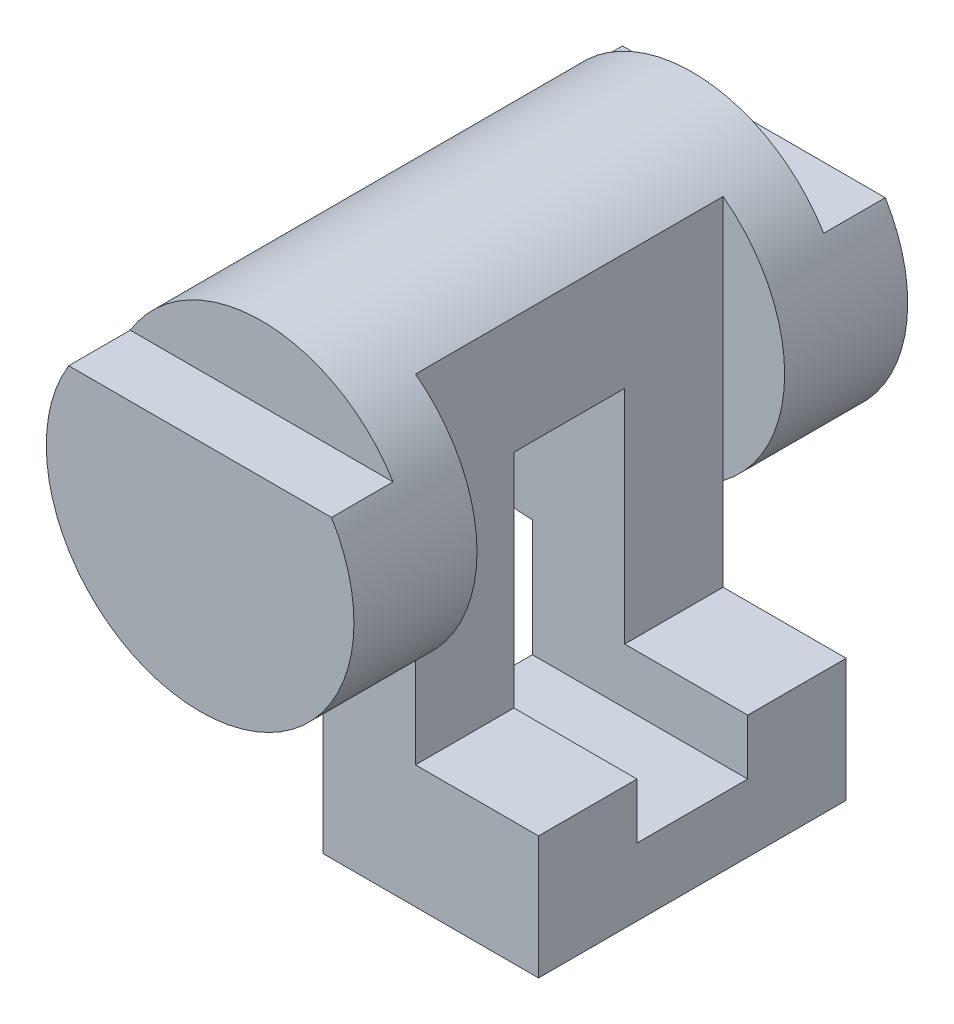
ISO-10303-21;
HEADER;
FILE_DESCRIPTION(('STEP AP214'),'2;1');
FILE_NAME('part.step','',(''),(''),'','','');
FILE_SCHEMA(('AUTOMOTIVE_DESIGN { 1 0 10303 214 1 1 1 1 }'));
ENDSEC;
DATA;
#1=APPLICATION_CONTEXT('core data for automotive mechanical design processes');
#2=APPLICATION_PROTOCOL_DEFINITION('international standard','automotive_design',2000,#1);
#3=PRODUCT_CONTEXT('',#1,'mechanical');
#4=PRODUCT('Part','Part','',(#3));
#5=PRODUCT_RELATED_PRODUCT_CATEGORY('part','',(#4));
#6=PRODUCT_DEFINITION_FORMATION('','',#4);
#7=PRODUCT_DEFINITION_CONTEXT('part definition',#1,'design');
#8=PRODUCT_DEFINITION('design','',#6,#7);
#9=PRODUCT_DEFINITION_SHAPE('','',#8);
#10=(LENGTH_UNIT() NAMED_UNIT(*) SI_UNIT(.MILLI.,.METRE.));
#11=(NAMED_UNIT(*) PLANE_ANGLE_UNIT() SI_UNIT($,.RADIAN.));
#12=(NAMED_UNIT(*) SI_UNIT($,.STERADIAN.) SOLID_ANGLE_UNIT());
#13=UNCERTAINTY_MEASURE_WITH_UNIT(LENGTH_MEASURE(1.E-05),#10,'distance_accuracy_value','');
#14=(GEOMETRIC_REPRESENTATION_CONTEXT(3) GLOBAL_UNCERTAINTY_ASSIGNED_CONTEXT((#13)) GLOBAL_UNIT_ASSIGNED_CONTEXT((#10,
#11,#12)) REPRESENTATION_CONTEXT('',''));
#15=CARTESIAN_POINT('',(0.,0.,0.));
#16=DIRECTION('',(0.,0.,1.));
#17=DIRECTION('',(1.,0.,0.));
#18=AXIS2_PLACEMENT_3D('',#15,#16,#17);
#19=CARTESIAN_POINT('',(0.,-35.,0.));
#20=DIRECTION('',(0.,-1.,0.));
#21=DIRECTION('',(0.,0.,-1.));
#22=AXIS2_PLACEMENT_3D('',#19,#20,#21);
#23=PLANE('',#22);
#24=DIRECTION('',(0.,0.,-1.));
#25=VECTOR('',#24,1.);
#26=CARTESIAN_POINT('',(35.,-35.,25.));
#27=LINE('',#26,#25);
#28=CARTESIAN_POINT('',(35.,-35.,25.));
#29=VERTEX_POINT('',#28);
#30=CARTESIAN_POINT('',(35.,-35.,9.));
#31=VERTEX_POINT('',#30);
#32=EDGE_CURVE('E216',#29,#31,#27,.T.);
#33=ORIENTED_EDGE('',*,*,#32,.T.);
#34=DIRECTION('',(-1.,0.,0.));
#35=VECTOR('',#34,1.);
#36=CARTESIAN_POINT('',(0.,-35.,9.));
#37=LINE('',#36,#35);
#38=CARTESIAN_POINT('',(15.,-35.,9.));
#39=VERTEX_POINT('',#38);
#40=EDGE_CURVE('E48',#31,#39,#37,.T.);
#41=ORIENTED_EDGE('',*,*,#40,.T.);
#42=DIRECTION('',(0.,0.,1.));
#43=VECTOR('',#42,1.);
#44=CARTESIAN_POINT('',(15.,-35.,25.));
#45=LINE('',#44,#43);
#46=CARTESIAN_POINT('',(15.,-35.,25.));
#47=VERTEX_POINT('',#46);
#48=EDGE_CURVE('E227',#39,#47,#45,.T.);
#49=ORIENTED_EDGE('',*,*,#48,.T.);
#50=DIRECTION('',(1.,0.,0.));
#51=VECTOR('',#50,1.);
#52=CARTESIAN_POINT('',(35.,-35.,25.));
#53=LINE('',#52,#51);
#54=EDGE_CURVE('E220',#47,#29,#53,.T.);
#55=ORIENTED_EDGE('',*,*,#54,.T.);
#56=EDGE_LOOP('',(#33,#41,#49,#55));
#57=FACE_BOUND('',#56,.T.);
#58=ADVANCED_FACE('F40',(#57),#23,.F.);
#59=CARTESIAN_POINT('',(0.,0.,45.));
#60=DIRECTION('',(0.,0.,-1.));
#61=DIRECTION('',(-1.,0.,0.));
#62=AXIS2_PLACEMENT_3D('',#59,#60,#61);
#63=CYLINDRICAL_SURFACE('',#62,25.);
#64=DIRECTION('',(0.,0.,-1.));
#65=VECTOR('',#64,1.);
#66=CARTESIAN_POINT('',(0.,-25.,45.));
#67=LINE('',#66,#65);
#68=CARTESIAN_POINT('',(0.,-25.,-8.99999999999999));
#69=VERTEX_POINT('',#68);
#70=CARTESIAN_POINT('',(0.,-25.,-25.));
#71=VERTEX_POINT('',#70);
#72=EDGE_CURVE('E293',#69,#71,#67,.T.);
#73=ORIENTED_EDGE('',*,*,#72,.F.);
#74=CARTESIAN_POINT('',(0.,0.,-9.));
#75=DIRECTION('',(0.,0.,-1.));
#76=DIRECTION('',(0.,1.,0.));
#77=AXIS2_PLACEMENT_3D('',#74,#75,#76);
#78=CIRCLE('',#77,25.);
#79=CARTESIAN_POINT('',(-24.9799919935936,0.999999999999994,-9.));
#80=VERTEX_POINT('',#79);
#81=EDGE_CURVE('E200',#69,#80,#78,.T.);
#82=ORIENTED_EDGE('',*,*,#81,.T.);
#83=DIRECTION('',(0.,0.,-1.));
#84=VECTOR('',#83,1.);
#85=CARTESIAN_POINT('',(-24.9799919935936,0.999999999999994,45.));
#86=LINE('',#85,#84);
#87=CARTESIAN_POINT('',(-24.9799919935936,0.999999999999994,9.));
#88=VERTEX_POINT('',#87);
#89=EDGE_CURVE('E209',#80,#88,#86,.F.);
#90=ORIENTED_EDGE('',*,*,#89,.T.);
#91=CARTESIAN_POINT('',(0.,0.,9.));
#92=DIRECTION('',(0.,0.,1.));
#93=DIRECTION('',(0.,-1.,0.));
#94=AXIS2_PLACEMENT_3D('',#91,#92,#93);
#95=CIRCLE('',#94,25.);
#96=CARTESIAN_POINT('',(0.,-25.,9.));
#97=VERTEX_POINT('',#96);
#98=EDGE_CURVE('E207',#88,#97,#95,.T.);
#99=ORIENTED_EDGE('',*,*,#98,.T.);
#100=CARTESIAN_POINT('',(0.,-25.,25.));
#101=VERTEX_POINT('',#100);
#102=EDGE_CURVE('E294',#101,#97,#67,.T.);
#103=ORIENTED_EDGE('',*,*,#102,.F.);
#104=CARTESIAN_POINT('',(0.,0.,25.));
#105=DIRECTION('',(0.,0.,-1.));
#106=DIRECTION('',(-1.,0.,0.));
#107=AXIS2_PLACEMENT_3D('',#104,#105,#106);
#108=CIRCLE('',#107,25.);
#109=CARTESIAN_POINT('',(15.,-20.,25.));
#110=VERTEX_POINT('',#109);
#111=EDGE_CURVE('E290',#110,#101,#108,.T.);
#112=ORIENTED_EDGE('',*,*,#111,.F.);
#113=CARTESIAN_POINT('',(15.,20.,25.));
#114=VERTEX_POINT('',#113);
#115=EDGE_CURVE('E291',#114,#110,#108,.T.);
#116=ORIENTED_EDGE('',*,*,#115,.F.);
#117=DIRECTION('',(0.,0.,-1.));
#118=VECTOR('',#117,1.);
#119=CARTESIAN_POINT('',(15.,20.,45.));
#120=LINE('',#119,#118);
#121=CARTESIAN_POINT('',(15.,20.,-25.));
#122=VERTEX_POINT('',#121);
#123=EDGE_CURVE('E218',#114,#122,#120,.T.);
#124=ORIENTED_EDGE('',*,*,#123,.T.);
#125=CARTESIAN_POINT('',(0.,0.,-25.));
#126=DIRECTION('',(0.,0.,1.));
#127=DIRECTION('',(1.,0.,0.));
#128=AXIS2_PLACEMENT_3D('',#125,#126,#127);
#129=CIRCLE('',#128,25.);
#130=CARTESIAN_POINT('',(15.,-20.,-25.));
#131=VERTEX_POINT('',#130);
#132=EDGE_CURVE('E284',#131,#122,#129,.T.);
#133=ORIENTED_EDGE('',*,*,#132,.F.);
#134=EDGE_CURVE('E287',#71,#131,#129,.T.);
#135=ORIENTED_EDGE('',*,*,#134,.F.);
#136=EDGE_LOOP('',(#73,#82,#90,#99,#103,#112,#116,#124,#133,#135));
#137=FACE_BOUND('',#136,.T.);
#138=DIRECTION('',(0.,0.,-1.));
#139=VECTOR('',#138,1.);
#140=CARTESIAN_POINT('',(21.3541565040626,13.,-35.));
#141=LINE('',#140,#139);
#142=CARTESIAN_POINT('',(21.3541565040626,13.,-35.));
#143=VERTEX_POINT('',#142);
#144=CARTESIAN_POINT('',(21.3541565040626,13.,-45.));
#145=VERTEX_POINT('',#144);
#146=EDGE_CURVE('E261',#143,#145,#141,.T.);
#147=ORIENTED_EDGE('',*,*,#146,.F.);
#148=CARTESIAN_POINT('',(0.,0.,-35.));
#149=DIRECTION('',(0.,0.,1.));
#150=DIRECTION('',(1.,0.,0.));
#151=AXIS2_PLACEMENT_3D('',#148,#149,#150);
#152=CIRCLE('',#151,25.);
#153=CARTESIAN_POINT('',(-21.3541565040626,13.,-35.));
#154=VERTEX_POINT('',#153);
#155=EDGE_CURVE('E256',#143,#154,#152,.T.);
#156=ORIENTED_EDGE('',*,*,#155,.T.);
#157=DIRECTION('',(0.,0.,-1.));
#158=VECTOR('',#157,1.);
#159=CARTESIAN_POINT('',(-21.3541565040626,13.,-35.));
#160=LINE('',#159,#158);
#161=CARTESIAN_POINT('',(-21.3541565040626,13.,-45.));
#162=VERTEX_POINT('',#161);
#163=EDGE_CURVE('E265',#154,#162,#160,.T.);
#164=ORIENTED_EDGE('',*,*,#163,.T.);
#165=CARTESIAN_POINT('',(0.,0.,-45.));
#166=DIRECTION('',(0.,0.,1.));
#167=DIRECTION('',(1.,0.,0.));
#168=AXIS2_PLACEMENT_3D('',#165,#166,#167);
#169=CIRCLE('',#168,25.);
#170=EDGE_CURVE('E279',#162,#145,#169,.T.);
#171=ORIENTED_EDGE('',*,*,#170,.T.);
#172=EDGE_LOOP('',(#147,#156,#164,#171));
#173=FACE_BOUND('',#172,.T.);
#174=CARTESIAN_POINT('',(0.,0.,45.));
#175=DIRECTION('',(0.,0.,1.));
#176=DIRECTION('',(1.,0.,0.));
#177=AXIS2_PLACEMENT_3D('',#174,#175,#176);
#178=CIRCLE('',#177,25.);
#179=CARTESIAN_POINT('',(-21.3541565040626,13.,45.));
#180=VERTEX_POINT('',#179);
#181=CARTESIAN_POINT('',(21.3541565040626,13.,45.));
#182=VERTEX_POINT('',#181);
#183=EDGE_CURVE('E281',#180,#182,#178,.T.);
#184=ORIENTED_EDGE('',*,*,#183,.F.);
#185=DIRECTION('',(0.,0.,1.));
#186=VECTOR('',#185,1.);
#187=CARTESIAN_POINT('',(-21.3541565040626,13.,35.));
#188=LINE('',#187,#186);
#189=CARTESIAN_POINT('',(-21.3541565040626,13.,35.));
#190=VERTEX_POINT('',#189);
#191=EDGE_CURVE('E274',#190,#180,#188,.T.);
#192=ORIENTED_EDGE('',*,*,#191,.F.);
#193=CARTESIAN_POINT('',(0.,0.,35.));
#194=DIRECTION('',(0.,0.,1.));
#195=DIRECTION('',(1.,0.,0.));
#196=AXIS2_PLACEMENT_3D('',#193,#194,#195);
#197=CIRCLE('',#196,25.);
#198=CARTESIAN_POINT('',(21.3541565040626,13.,35.));
#199=VERTEX_POINT('',#198);
#200=EDGE_CURVE('E269',#199,#190,#197,.T.);
#201=ORIENTED_EDGE('',*,*,#200,.F.);
#202=DIRECTION('',(0.,0.,1.));
#203=VECTOR('',#202,1.);
#204=CARTESIAN_POINT('',(21.3541565040626,13.,35.));
#205=LINE('',#204,#203);
#206=EDGE_CURVE('E276',#199,#182,#205,.T.);
#207=ORIENTED_EDGE('',*,*,#206,.T.);
#208=EDGE_LOOP('',(#184,#192,#201,#207));
#209=FACE_BOUND('',#208,.T.);
#210=ADVANCED_FACE('F42',(#137,#173,#209),#63,.T.);
#211=CARTESIAN_POINT('',(0.,0.,-45.));
#212=DIRECTION('',(0.,0.,1.));
#213=DIRECTION('',(1.,0.,0.));
#214=AXIS2_PLACEMENT_3D('',#211,#212,#213);
#215=PLANE('',#214);
#216=DIRECTION('',(1.,0.,0.));
#217=VECTOR('',#216,1.);
#218=CARTESIAN_POINT('',(0.,13.,-45.));
#219=LINE('',#218,#217);
#220=EDGE_CURVE('E255',#162,#145,#219,.T.);
#221=ORIENTED_EDGE('',*,*,#220,.T.);
#222=ORIENTED_EDGE('',*,*,#170,.F.);
#223=EDGE_LOOP('',(#221,#222));
#224=FACE_BOUND('',#223,.T.);
#225=ADVANCED_FACE('F360',(#224),#215,.F.);
#226=CARTESIAN_POINT('',(0.,0.,45.));
#227=DIRECTION('',(0.,0.,1.));
#228=DIRECTION('',(1.,0.,0.));
#229=AXIS2_PLACEMENT_3D('',#226,#227,#228);
#230=PLANE('',#229);
#231=DIRECTION('',(1.,0.,0.));
#232=VECTOR('',#231,1.);
#233=CARTESIAN_POINT('',(-21.3541565040626,13.,45.));
#234=LINE('',#233,#232);
#235=EDGE_CURVE('E268',#180,#182,#234,.T.);
#236=ORIENTED_EDGE('',*,*,#235,.F.);
#237=ORIENTED_EDGE('',*,*,#183,.T.);
#238=EDGE_LOOP('',(#236,#237));
#239=FACE_BOUND('',#238,.T.);
#240=ADVANCED_FACE('F492',(#239),#230,.T.);
#241=CARTESIAN_POINT('',(-21.3541565040626,13.,35.));
#242=DIRECTION('',(0.,-1.,0.));
#243=DIRECTION('',(0.,0.,-1.));
#244=AXIS2_PLACEMENT_3D('',#241,#242,#243);
#245=PLANE('',#244);
#246=ORIENTED_EDGE('',*,*,#235,.T.);
#247=ORIENTED_EDGE('',*,*,#206,.F.);
#248=DIRECTION('',(1.,0.,0.));
#249=VECTOR('',#248,1.);
#250=CARTESIAN_POINT('',(-21.3541565040626,13.,35.));
#251=LINE('',#250,#249);
#252=EDGE_CURVE('E271',#190,#199,#251,.T.);
#253=ORIENTED_EDGE('',*,*,#252,.F.);
#254=ORIENTED_EDGE('',*,*,#191,.T.);
#255=EDGE_LOOP('',(#246,#247,#253,#254));
#256=FACE_BOUND('',#255,.T.);
#257=ADVANCED_FACE('F501',(#256),#245,.F.);
#258=CARTESIAN_POINT('',(0.,0.,35.));
#259=DIRECTION('',(0.,0.,1.));
#260=DIRECTION('',(1.,0.,0.));
#261=AXIS2_PLACEMENT_3D('',#258,#259,#260);
#262=PLANE('',#261);
#263=ORIENTED_EDGE('',*,*,#200,.T.);
#264=ORIENTED_EDGE('',*,*,#252,.T.);
#265=EDGE_LOOP('',(#263,#264));
#266=FACE_BOUND('',#265,.T.);
#267=ADVANCED_FACE('F482',(#266),#262,.T.);
#268=CARTESIAN_POINT('',(0.,13.,-35.));
#269=DIRECTION('',(0.,1.,0.));
#270=DIRECTION('',(0.,0.,1.));
#271=AXIS2_PLACEMENT_3D('',#268,#269,#270);
#272=PLANE('',#271);
#273=ORIENTED_EDGE('',*,*,#220,.F.);
#274=ORIENTED_EDGE('',*,*,#163,.F.);
#275=DIRECTION('',(1.,0.,0.));
#276=VECTOR('',#275,1.);
#277=CARTESIAN_POINT('',(0.,13.,-35.));
#278=LINE('',#277,#276);
#279=EDGE_CURVE('E259',#154,#143,#278,.T.);
#280=ORIENTED_EDGE('',*,*,#279,.T.);
#281=ORIENTED_EDGE('',*,*,#146,.T.);
#282=EDGE_LOOP('',(#273,#274,#280,#281));
#283=FACE_BOUND('',#282,.T.);
#284=ADVANCED_FACE('F472',(#283),#272,.T.);
#285=CARTESIAN_POINT('',(0.,0.,-35.));
#286=DIRECTION('',(0.,0.,1.));
#287=DIRECTION('',(1.,0.,0.));
#288=AXIS2_PLACEMENT_3D('',#285,#286,#287);
#289=PLANE('',#288);
#290=ORIENTED_EDGE('',*,*,#155,.F.);
#291=ORIENTED_EDGE('',*,*,#279,.F.);
#292=EDGE_LOOP('',(#290,#291));
#293=FACE_BOUND('',#292,.T.);
#294=ADVANCED_FACE('F425',(#293),#289,.F.);
#295=CARTESIAN_POINT('',(0.,13.,25.));
#296=DIRECTION('',(1.,0.,0.));
#297=DIRECTION('',(0.,0.,-1.));
#298=AXIS2_PLACEMENT_3D('',#295,#296,#297);
#299=PLANE('',#298);
#300=ORIENTED_EDGE('',*,*,#102,.T.);
#301=DIRECTION('',(0.,-1.,0.));
#302=VECTOR('',#301,1.);
#303=CARTESIAN_POINT('',(0.,13.,9.));
#304=LINE('',#303,#302);
#305=CARTESIAN_POINT('',(0.,-44.,9.));
#306=VERTEX_POINT('',#305);
#307=EDGE_CURVE('E205',#97,#306,#304,.T.);
#308=ORIENTED_EDGE('',*,*,#307,.T.);
#309=DIRECTION('',(0.,0.,-1.));
#310=VECTOR('',#309,1.);
#311=CARTESIAN_POINT('',(0.,-44.,25.));
#312=LINE('',#311,#310);
#313=CARTESIAN_POINT('',(0.,-44.,-9.));
#314=VERTEX_POINT('',#313);
#315=EDGE_CURVE('E169',#306,#314,#312,.T.);
#316=ORIENTED_EDGE('',*,*,#315,.T.);
#317=DIRECTION('',(0.,1.,0.));
#318=VECTOR('',#317,1.);
#319=CARTESIAN_POINT('',(0.,13.,-9.));
#320=LINE('',#319,#318);
#321=EDGE_CURVE('E197',#314,#69,#320,.T.);
#322=ORIENTED_EDGE('',*,*,#321,.T.);
#323=ORIENTED_EDGE('',*,*,#72,.T.);
#324=DIRECTION('',(0.,-1.,0.));
#325=VECTOR('',#324,1.);
#326=CARTESIAN_POINT('',(0.,13.,-25.));
#327=LINE('',#326,#325);
#328=CARTESIAN_POINT('',(0.,-55.,-25.));
#329=VERTEX_POINT('',#328);
#330=EDGE_CURVE('E247',#71,#329,#327,.T.);
#331=ORIENTED_EDGE('',*,*,#330,.T.);
#332=DIRECTION('',(0.,0.,1.));
#333=VECTOR('',#332,1.);
#334=CARTESIAN_POINT('',(0.,-55.,25.));
#335=LINE('',#334,#333);
#336=CARTESIAN_POINT('',(0.,-55.,25.));
#337=VERTEX_POINT('',#336);
#338=EDGE_CURVE('E235',#329,#337,#335,.T.);
#339=ORIENTED_EDGE('',*,*,#338,.T.);
#340=DIRECTION('',(0.,-1.,0.));
#341=VECTOR('',#340,1.);
#342=CARTESIAN_POINT('',(0.,13.,25.));
#343=LINE('',#342,#341);
#344=EDGE_CURVE('E253',#101,#337,#343,.T.);
#345=ORIENTED_EDGE('',*,*,#344,.F.);
#346=EDGE_LOOP('',(#300,#308,#316,#322,#323,#331,#339,#345));
#347=FACE_BOUND('',#346,.T.);
#348=ADVANCED_FACE('F338',(#347),#299,.F.);
#349=CARTESIAN_POINT('',(0.,13.,25.));
#350=DIRECTION('',(0.,0.,-1.));
#351=DIRECTION('',(-1.,0.,0.));
#352=AXIS2_PLACEMENT_3D('',#349,#350,#351);
#353=PLANE('',#352);
#354=DIRECTION('',(0.,-1.,0.));
#355=VECTOR('',#354,1.);
#356=CARTESIAN_POINT('',(35.,13.,25.));
#357=LINE('',#356,#355);
#358=CARTESIAN_POINT('',(35.,-55.,25.));
#359=VERTEX_POINT('',#358);
#360=EDGE_CURVE('E251',#29,#359,#357,.T.);
#361=ORIENTED_EDGE('',*,*,#360,.F.);
#362=ORIENTED_EDGE('',*,*,#54,.F.);
#363=DIRECTION('',(0.,1.,0.));
#364=VECTOR('',#363,1.);
#365=CARTESIAN_POINT('',(15.,-108.851648071345,25.));
#366=LINE('',#365,#364);
#367=EDGE_CURVE('E222',#47,#110,#366,.T.);
#368=ORIENTED_EDGE('',*,*,#367,.T.);
#369=ORIENTED_EDGE('',*,*,#111,.T.);
#370=ORIENTED_EDGE('',*,*,#344,.T.);
#371=DIRECTION('',(1.,0.,0.));
#372=VECTOR('',#371,1.);
#373=CARTESIAN_POINT('',(0.,-55.,25.));
#374=LINE('',#373,#372);
#375=EDGE_CURVE('E238',#337,#359,#374,.T.);
#376=ORIENTED_EDGE('',*,*,#375,.T.);
#377=EDGE_LOOP('',(#361,#362,#368,#369,#370,#376));
#378=FACE_BOUND('',#377,.T.);
#379=ADVANCED_FACE('F310',(#378),#353,.F.);
#380=CARTESIAN_POINT('',(35.,13.,25.));
#381=DIRECTION('',(-1.,0.,0.));
#382=DIRECTION('',(0.,0.,1.));
#383=AXIS2_PLACEMENT_3D('',#380,#381,#382);
#384=PLANE('',#383);
#385=DIRECTION('',(0.,0.,-1.));
#386=VECTOR('',#385,1.);
#387=CARTESIAN_POINT('',(35.,-44.,9.));
#388=LINE('',#387,#386);
#389=CARTESIAN_POINT('',(35.,-44.,9.));
#390=VERTEX_POINT('',#389);
#391=CARTESIAN_POINT('',(35.,-44.,-9.));
#392=VERTEX_POINT('',#391);
#393=EDGE_CURVE('E167',#390,#392,#388,.T.);
#394=ORIENTED_EDGE('',*,*,#393,.F.);
#395=DIRECTION('',(0.,-1.,0.));
#396=VECTOR('',#395,1.);
#397=CARTESIAN_POINT('',(35.,0.999999999999994,9.));
#398=LINE('',#397,#396);
#399=EDGE_CURVE('E175',#31,#390,#398,.T.);
#400=ORIENTED_EDGE('',*,*,#399,.F.);
#401=ORIENTED_EDGE('',*,*,#32,.F.);
#402=ORIENTED_EDGE('',*,*,#360,.T.);
#403=DIRECTION('',(0.,0.,-1.));
#404=VECTOR('',#403,1.);
#405=CARTESIAN_POINT('',(35.,-55.,25.));
#406=LINE('',#405,#404);
#407=CARTESIAN_POINT('',(35.,-55.,-25.));
#408=VERTEX_POINT('',#407);
#409=EDGE_CURVE('E241',#359,#408,#406,.T.);
#410=ORIENTED_EDGE('',*,*,#409,.T.);
#411=DIRECTION('',(0.,-1.,0.));
#412=VECTOR('',#411,1.);
#413=CARTESIAN_POINT('',(35.,13.,-25.));
#414=LINE('',#413,#412);
#415=CARTESIAN_POINT('',(35.,-35.,-25.));
#416=VERTEX_POINT('',#415);
#417=EDGE_CURVE('E249',#416,#408,#414,.T.);
#418=ORIENTED_EDGE('',*,*,#417,.F.);
#419=CARTESIAN_POINT('',(35.,-35.,-9.));
#420=VERTEX_POINT('',#419);
#421=EDGE_CURVE('E219',#420,#416,#27,.T.);
#422=ORIENTED_EDGE('',*,*,#421,.F.);
#423=DIRECTION('',(0.,1.,0.));
#424=VECTOR('',#423,1.);
#425=CARTESIAN_POINT('',(35.,0.999999999999994,-9.));
#426=LINE('',#425,#424);
#427=EDGE_CURVE('E62',#392,#420,#426,.T.);
#428=ORIENTED_EDGE('',*,*,#427,.F.);
#429=EDGE_LOOP('',(#394,#400,#401,#402,#410,#418,#422,#428));
#430=FACE_BOUND('',#429,.T.);
#431=ADVANCED_FACE('F183',(#430),#384,.F.);
#432=CARTESIAN_POINT('',(0.,13.,-25.));
#433=DIRECTION('',(0.,0.,1.));
#434=DIRECTION('',(1.,0.,0.));
#435=AXIS2_PLACEMENT_3D('',#432,#433,#434);
#436=PLANE('',#435);
#437=DIRECTION('',(0.,1.,0.));
#438=VECTOR('',#437,1.);
#439=CARTESIAN_POINT('',(15.,-108.851648071345,-25.));
#440=LINE('',#439,#438);
#441=CARTESIAN_POINT('',(15.,-35.,-25.));
#442=VERTEX_POINT('',#441);
#443=EDGE_CURVE('E230',#442,#131,#440,.T.);
#444=ORIENTED_EDGE('',*,*,#443,.F.);
#445=DIRECTION('',(-1.,0.,0.));
#446=VECTOR('',#445,1.);
#447=CARTESIAN_POINT('',(35.,-35.,-25.));
#448=LINE('',#447,#446);
#449=EDGE_CURVE('E213',#416,#442,#448,.T.);
#450=ORIENTED_EDGE('',*,*,#449,.F.);
#451=ORIENTED_EDGE('',*,*,#417,.T.);
#452=DIRECTION('',(-1.,0.,0.));
#453=VECTOR('',#452,1.);
#454=CARTESIAN_POINT('',(0.,-55.,-25.));
#455=LINE('',#454,#453);
#456=EDGE_CURVE('E244',#408,#329,#455,.T.);
#457=ORIENTED_EDGE('',*,*,#456,.T.);
#458=ORIENTED_EDGE('',*,*,#330,.F.);
#459=ORIENTED_EDGE('',*,*,#134,.T.);
#460=EDGE_LOOP('',(#444,#450,#451,#457,#458,#459));
#461=FACE_BOUND('',#460,.T.);
#462=ADVANCED_FACE('F322',(#461),#436,.F.);
#463=CARTESIAN_POINT('',(0.,-55.,0.));
#464=DIRECTION('',(0.,-1.,0.));
#465=DIRECTION('',(0.,0.,-1.));
#466=AXIS2_PLACEMENT_3D('',#463,#464,#465);
#467=PLANE('',#466);
#468=ORIENTED_EDGE('',*,*,#338,.F.);
#469=ORIENTED_EDGE('',*,*,#456,.F.);
#470=ORIENTED_EDGE('',*,*,#409,.F.);
#471=ORIENTED_EDGE('',*,*,#375,.F.);
#472=EDGE_LOOP('',(#468,#469,#470,#471));
#473=FACE_BOUND('',#472,.T.);
#474=ADVANCED_FACE('F318',(#473),#467,.T.);
#475=CARTESIAN_POINT('',(35.,-108.851648071345,-25.));
#476=DIRECTION('',(0.,0.,-1.));
#477=DIRECTION('',(-1.,0.,0.));
#478=AXIS2_PLACEMENT_3D('',#475,#476,#477);
#479=PLANE('',#478);
#480=ORIENTED_EDGE('',*,*,#132,.T.);
#481=EDGE_CURVE('E215',#131,#122,#440,.T.);
#482=ORIENTED_EDGE('',*,*,#481,.F.);
#483=EDGE_LOOP('',(#480,#482));
#484=FACE_BOUND('',#483,.T.);
#485=ADVANCED_FACE('F346',(#484),#479,.F.);
#486=CARTESIAN_POINT('',(35.,-108.851648071345,25.));
#487=DIRECTION('',(0.,0.,1.));
#488=DIRECTION('',(1.,0.,0.));
#489=AXIS2_PLACEMENT_3D('',#486,#487,#488);
#490=PLANE('',#489);
#491=ORIENTED_EDGE('',*,*,#115,.T.);
#492=EDGE_CURVE('E226',#110,#114,#366,.T.);
#493=ORIENTED_EDGE('',*,*,#492,.T.);
#494=EDGE_LOOP('',(#491,#493));
#495=FACE_BOUND('',#494,.T.);
#496=ADVANCED_FACE('F344',(#495),#490,.F.);
#497=CARTESIAN_POINT('',(15.,-108.851648071345,25.));
#498=DIRECTION('',(-1.,0.,0.));
#499=DIRECTION('',(0.,0.,1.));
#500=AXIS2_PLACEMENT_3D('',#497,#498,#499);
#501=PLANE('',#500);
#502=ORIENTED_EDGE('',*,*,#48,.F.);
#503=DIRECTION('',(0.,1.,0.));
#504=VECTOR('',#503,1.);
#505=CARTESIAN_POINT('',(15.,-108.851648071345,8.99999999999999));
#506=LINE('',#505,#504);
#507=CARTESIAN_POINT('',(15.,0.999999999999994,9.));
#508=VERTEX_POINT('',#507);
#509=EDGE_CURVE('E202',#39,#508,#506,.T.);
#510=ORIENTED_EDGE('',*,*,#509,.T.);
#511=DIRECTION('',(0.,0.,-1.));
#512=VECTOR('',#511,1.);
#513=CARTESIAN_POINT('',(15.,1.,25.));
#514=LINE('',#513,#512);
#515=CARTESIAN_POINT('',(15.,0.999999999999994,-9.));
#516=VERTEX_POINT('',#515);
#517=EDGE_CURVE('E12',#508,#516,#514,.T.);
#518=ORIENTED_EDGE('',*,*,#517,.T.);
#519=DIRECTION('',(0.,-1.,0.));
#520=VECTOR('',#519,1.);
#521=CARTESIAN_POINT('',(15.,-108.851648071345,-8.99999999999998));
#522=LINE('',#521,#520);
#523=CARTESIAN_POINT('',(15.,-35.,-9.));
#524=VERTEX_POINT('',#523);
#525=EDGE_CURVE('E190',#516,#524,#522,.T.);
#526=ORIENTED_EDGE('',*,*,#525,.T.);
#527=EDGE_CURVE('E223',#442,#524,#45,.T.);
#528=ORIENTED_EDGE('',*,*,#527,.F.);
#529=ORIENTED_EDGE('',*,*,#443,.T.);
#530=ORIENTED_EDGE('',*,*,#481,.T.);
#531=ORIENTED_EDGE('',*,*,#123,.F.);
#532=ORIENTED_EDGE('',*,*,#492,.F.);
#533=ORIENTED_EDGE('',*,*,#367,.F.);
#534=EDGE_LOOP('',(#502,#510,#518,#526,#528,#529,#530,#531,#532,#533));
#535=FACE_BOUND('',#534,.T.);
#536=ADVANCED_FACE('F302',(#535),#501,.F.);
#537=ORIENTED_EDGE('',*,*,#527,.T.);
#538=DIRECTION('',(1.,0.,0.));
#539=VECTOR('',#538,1.);
#540=CARTESIAN_POINT('',(0.,-35.,-9.));
#541=LINE('',#540,#539);
#542=EDGE_CURVE('E297',#524,#420,#541,.T.);
#543=ORIENTED_EDGE('',*,*,#542,.T.);
#544=ORIENTED_EDGE('',*,*,#421,.T.);
#545=ORIENTED_EDGE('',*,*,#449,.T.);
#546=EDGE_LOOP('',(#537,#543,#544,#545));
#547=FACE_BOUND('',#546,.T.);
#548=ADVANCED_FACE('F325',(#547),#23,.F.);
#549=CARTESIAN_POINT('',(-25.,-44.,9.));
#550=DIRECTION('',(0.,-1.,0.));
#551=DIRECTION('',(0.,0.,-1.));
#552=AXIS2_PLACEMENT_3D('',#549,#550,#551);
#553=PLANE('',#552);
#554=DIRECTION('',(1.,0.,0.));
#555=VECTOR('',#554,1.);
#556=CARTESIAN_POINT('',(-25.,-44.,9.));
#557=LINE('',#556,#555);
#558=EDGE_CURVE('E163',#306,#390,#557,.T.);
#559=ORIENTED_EDGE('',*,*,#558,.T.);
#560=ORIENTED_EDGE('',*,*,#393,.T.);
#561=DIRECTION('',(1.,0.,0.));
#562=VECTOR('',#561,1.);
#563=CARTESIAN_POINT('',(-25.,-44.,-9.));
#564=LINE('',#563,#562);
#565=EDGE_CURVE('E55',#314,#392,#564,.T.);
#566=ORIENTED_EDGE('',*,*,#565,.F.);
#567=ORIENTED_EDGE('',*,*,#315,.F.);
#568=EDGE_LOOP('',(#559,#560,#566,#567));
#569=FACE_BOUND('',#568,.T.);
#570=ADVANCED_FACE('F165',(#569),#553,.F.);
#571=CARTESIAN_POINT('',(-25.,0.999999999999994,9.));
#572=DIRECTION('',(0.,1.,0.));
#573=DIRECTION('',(0.,0.,1.));
#574=AXIS2_PLACEMENT_3D('',#571,#572,#573);
#575=PLANE('',#574);
#576=DIRECTION('',(1.,0.,0.));
#577=VECTOR('',#576,1.);
#578=CARTESIAN_POINT('',(-25.,0.999999999999994,-9.));
#579=LINE('',#578,#577);
#580=EDGE_CURVE('E191',#80,#516,#579,.T.);
#581=ORIENTED_EDGE('',*,*,#580,.T.);
#582=ORIENTED_EDGE('',*,*,#517,.F.);
#583=DIRECTION('',(1.,0.,0.));
#584=VECTOR('',#583,1.);
#585=CARTESIAN_POINT('',(-25.,0.999999999999994,9.));
#586=LINE('',#585,#584);
#587=EDGE_CURVE('E188',#88,#508,#586,.T.);
#588=ORIENTED_EDGE('',*,*,#587,.F.);
#589=ORIENTED_EDGE('',*,*,#89,.F.);
#590=EDGE_LOOP('',(#581,#582,#588,#589));
#591=FACE_BOUND('',#590,.T.);
#592=ADVANCED_FACE('F331',(#591),#575,.F.);
#593=CARTESIAN_POINT('',(-25.,0.999999999999994,9.));
#594=DIRECTION('',(0.,0.,1.));
#595=DIRECTION('',(0.,-1.,0.));
#596=AXIS2_PLACEMENT_3D('',#593,#594,#595);
#597=PLANE('',#596);
#598=ORIENTED_EDGE('',*,*,#587,.T.);
#599=ORIENTED_EDGE('',*,*,#509,.F.);
#600=ORIENTED_EDGE('',*,*,#40,.F.);
#601=ORIENTED_EDGE('',*,*,#399,.T.);
#602=ORIENTED_EDGE('',*,*,#558,.F.);
#603=ORIENTED_EDGE('',*,*,#307,.F.);
#604=ORIENTED_EDGE('',*,*,#98,.F.);
#605=EDGE_LOOP('',(#598,#599,#600,#601,#602,#603,#604));
#606=FACE_BOUND('',#605,.T.);
#607=ADVANCED_FACE('F177',(#606),#597,.F.);
#608=CARTESIAN_POINT('',(-25.,0.999999999999994,-9.));
#609=DIRECTION('',(0.,0.,-1.));
#610=DIRECTION('',(0.,1.,0.));
#611=AXIS2_PLACEMENT_3D('',#608,#609,#610);
#612=PLANE('',#611);
#613=ORIENTED_EDGE('',*,*,#81,.F.);
#614=ORIENTED_EDGE('',*,*,#321,.F.);
#615=ORIENTED_EDGE('',*,*,#565,.T.);
#616=ORIENTED_EDGE('',*,*,#427,.T.);
#617=ORIENTED_EDGE('',*,*,#542,.F.);
#618=ORIENTED_EDGE('',*,*,#525,.F.);
#619=ORIENTED_EDGE('',*,*,#580,.F.);
#620=EDGE_LOOP('',(#613,#614,#615,#616,#617,#618,#619));
#621=FACE_BOUND('',#620,.T.);
#622=ADVANCED_FACE('F327',(#621),#612,.F.);
#623=CLOSED_SHELL('',(#58,#210,#225,#240,#257,#267,#284,#294,#348,#379,#431,#462,#474,#485,#496,
#536,#548,#570,#592,#607,#622));
#624=MANIFOLD_SOLID_BREP('B2',#623);
#625=ADVANCED_BREP_SHAPE_REPRESENTATION('',(#18,#624),#14);
#626=SHAPE_DEFINITION_REPRESENTATION(#9,#625);
ENDSEC;
END-ISO-10303-21;
